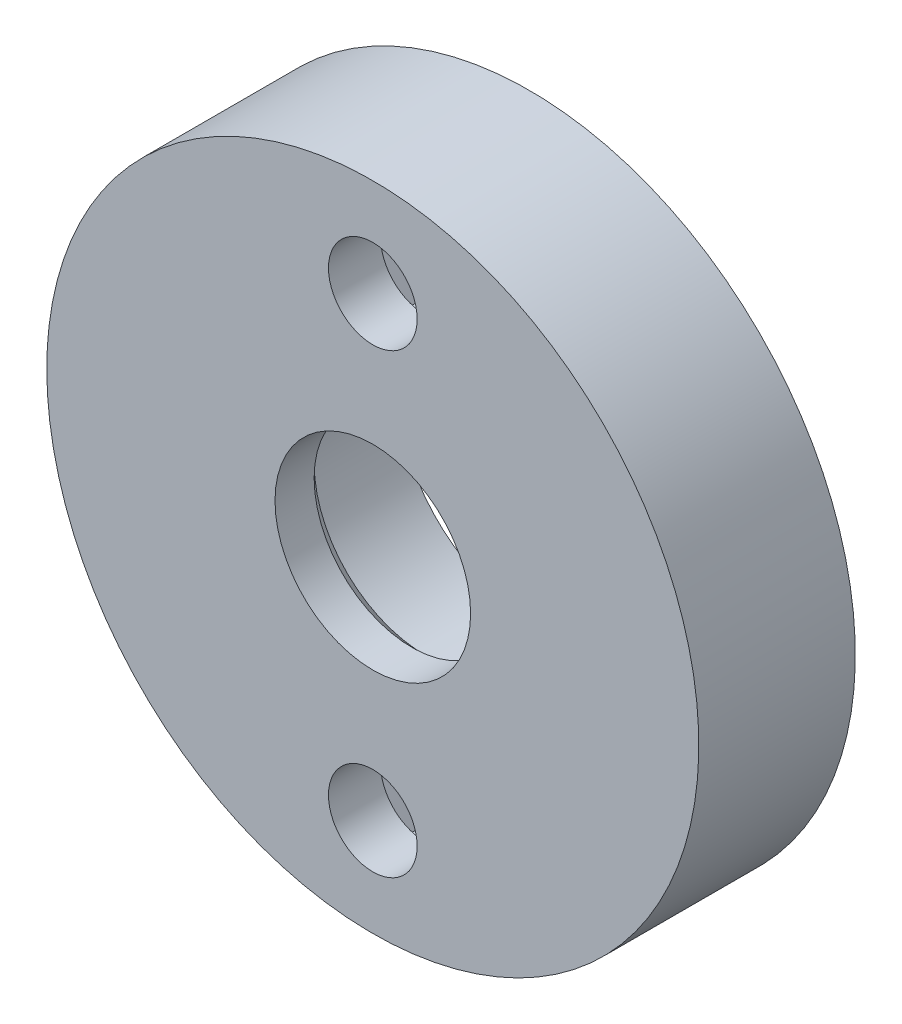
ISO-10303-21;
HEADER;
FILE_DESCRIPTION(('STEP AP214'),'2;1');
FILE_NAME('part.step','',(''),(''),'','','');
FILE_SCHEMA(('AUTOMOTIVE_DESIGN { 1 0 10303 214 1 1 1 1 }'));
ENDSEC;
DATA;
#1=APPLICATION_CONTEXT('core data for automotive mechanical design processes');
#2=APPLICATION_PROTOCOL_DEFINITION('international standard','automotive_design',2000,#1);
#3=PRODUCT_CONTEXT('',#1,'mechanical');
#4=PRODUCT('Part','Part','',(#3));
#5=PRODUCT_RELATED_PRODUCT_CATEGORY('part','',(#4));
#6=PRODUCT_DEFINITION_FORMATION('','',#4);
#7=PRODUCT_DEFINITION_CONTEXT('part definition',#1,'design');
#8=PRODUCT_DEFINITION('design','',#6,#7);
#9=PRODUCT_DEFINITION_SHAPE('','',#8);
#10=(LENGTH_UNIT() NAMED_UNIT(*) SI_UNIT(.MILLI.,.METRE.));
#11=(NAMED_UNIT(*) PLANE_ANGLE_UNIT() SI_UNIT($,.RADIAN.));
#12=(NAMED_UNIT(*) SI_UNIT($,.STERADIAN.) SOLID_ANGLE_UNIT());
#13=UNCERTAINTY_MEASURE_WITH_UNIT(LENGTH_MEASURE(1.E-05),#10,'distance_accuracy_value','');
#14=(GEOMETRIC_REPRESENTATION_CONTEXT(3) GLOBAL_UNCERTAINTY_ASSIGNED_CONTEXT((#13)) GLOBAL_UNIT_ASSIGNED_CONTEXT((#10,
#11,#12)) REPRESENTATION_CONTEXT('',''));
#15=CARTESIAN_POINT('',(0.,0.,0.));
#16=DIRECTION('',(0.,0.,1.));
#17=DIRECTION('',(1.,0.,0.));
#18=AXIS2_PLACEMENT_3D('',#15,#16,#17);
#19=CARTESIAN_POINT('',(0.,0.,6.));
#20=DIRECTION('',(0.,0.,1.));
#21=DIRECTION('',(-1.,0.,0.));
#22=AXIS2_PLACEMENT_3D('',#19,#20,#21);
#23=ELLIPSE('',#22,12.5,12.5);
#24=DIRECTION('',(0.,0.,-1.));
#25=VECTOR('',#24,1.);
#26=SURFACE_OF_LINEAR_EXTRUSION('',#23,#25);
#27=CARTESIAN_POINT('',(-12.5,0.,6.));
#28=VERTEX_POINT('',#27);
#29=EDGE_CURVE('E249',#28,#28,#23,.T.);
#30=ORIENTED_EDGE('',*,*,#29,.F.);
#31=EDGE_LOOP('',(#30));
#32=FACE_BOUND('',#31,.T.);
#33=CARTESIAN_POINT('',(0.,0.,0.));
#34=DIRECTION('',(0.,0.,1.));
#35=DIRECTION('',(-1.,0.,0.));
#36=AXIS2_PLACEMENT_3D('',#33,#34,#35);
#37=ELLIPSE('',#36,12.5,12.5);
#38=CARTESIAN_POINT('',(-12.5,0.,0.));
#39=VERTEX_POINT('',#38);
#40=EDGE_CURVE('E246',#39,#39,#37,.T.);
#41=ORIENTED_EDGE('',*,*,#40,.T.);
#42=EDGE_LOOP('',(#41));
#43=FACE_BOUND('',#42,.T.);
#44=ADVANCED_FACE('F45',(#32,#43),#26,.F.);
#45=CARTESIAN_POINT('',(0.,0.,6.));
#46=DIRECTION('',(0.,0.,1.));
#47=DIRECTION('',(1.,0.,0.));
#48=AXIS2_PLACEMENT_3D('',#45,#46,#47);
#49=PLANE('',#48);
#50=CARTESIAN_POINT('',(0.,8.74999999999999,6.));
#51=DIRECTION('',(0.,0.,1.));
#52=DIRECTION('',(1.,0.,0.));
#53=AXIS2_PLACEMENT_3D('',#50,#51,#52);
#54=CIRCLE('',#53,1.7);
#55=CARTESIAN_POINT('',(1.7,8.74999999999999,6.));
#56=VERTEX_POINT('',#55);
#57=EDGE_CURVE('E338',#56,#56,#54,.F.);
#58=ORIENTED_EDGE('',*,*,#57,.T.);
#59=EDGE_LOOP('',(#58));
#60=FACE_BOUND('',#59,.T.);
#61=CARTESIAN_POINT('',(0.,-8.74999999999999,6.));
#62=DIRECTION('',(0.,0.,1.));
#63=DIRECTION('',(1.,0.,0.));
#64=AXIS2_PLACEMENT_3D('',#61,#62,#63);
#65=CIRCLE('',#64,1.7);
#66=CARTESIAN_POINT('',(1.7,-8.74999999999999,6.));
#67=VERTEX_POINT('',#66);
#68=EDGE_CURVE('E342',#67,#67,#65,.F.);
#69=ORIENTED_EDGE('',*,*,#68,.T.);
#70=EDGE_LOOP('',(#69));
#71=FACE_BOUND('',#70,.T.);
#72=CARTESIAN_POINT('',(0.,0.,6.));
#73=DIRECTION('',(0.,0.,1.));
#74=DIRECTION('',(1.,0.,0.));
#75=AXIS2_PLACEMENT_3D('',#72,#73,#74);
#76=CIRCLE('',#75,3.75);
#77=CARTESIAN_POINT('',(3.75,0.,6.));
#78=VERTEX_POINT('',#77);
#79=EDGE_CURVE('E185',#78,#78,#76,.F.);
#80=ORIENTED_EDGE('',*,*,#79,.T.);
#81=EDGE_LOOP('',(#80));
#82=FACE_BOUND('',#81,.T.);
#83=ORIENTED_EDGE('',*,*,#29,.T.);
#84=EDGE_LOOP('',(#83));
#85=FACE_BOUND('',#84,.T.);
#86=ADVANCED_FACE('F255',(#60,#71,#82,#85),#49,.T.);
#87=CARTESIAN_POINT('',(0.,0.,0.));
#88=DIRECTION('',(0.,0.,1.));
#89=DIRECTION('',(1.,0.,0.));
#90=AXIS2_PLACEMENT_3D('',#87,#88,#89);
#91=PLANE('',#90);
#92=DIRECTION('',(0.5,0.866025403784439,0.));
#93=VECTOR('',#92,1.);
#94=CARTESIAN_POINT('',(-3.11769145362398,8.75,0.));
#95=LINE('',#94,#93);
#96=CARTESIAN_POINT('',(-3.11769145362398,8.75,0.));
#97=VERTEX_POINT('',#96);
#98=CARTESIAN_POINT('',(-1.55884572681199,11.45,0.));
#99=VERTEX_POINT('',#98);
#100=EDGE_CURVE('E173',#97,#99,#95,.T.);
#101=ORIENTED_EDGE('',*,*,#100,.F.);
#102=DIRECTION('',(-0.5,0.866025403784439,0.));
#103=VECTOR('',#102,1.);
#104=CARTESIAN_POINT('',(-1.55884572681199,6.04999999999999,0.));
#105=LINE('',#104,#103);
#106=CARTESIAN_POINT('',(-1.55884572681199,6.04999999999999,0.));
#107=VERTEX_POINT('',#106);
#108=EDGE_CURVE('E61',#107,#97,#105,.T.);
#109=ORIENTED_EDGE('',*,*,#108,.F.);
#110=DIRECTION('',(-1.,0.,0.));
#111=VECTOR('',#110,1.);
#112=CARTESIAN_POINT('',(1.55884572681199,6.04999999999999,0.));
#113=LINE('',#112,#111);
#114=CARTESIAN_POINT('',(1.55884572681199,6.04999999999999,0.));
#115=VERTEX_POINT('',#114);
#116=EDGE_CURVE('E156',#115,#107,#113,.T.);
#117=ORIENTED_EDGE('',*,*,#116,.F.);
#118=DIRECTION('',(-0.5,-0.866025403784439,0.));
#119=VECTOR('',#118,1.);
#120=CARTESIAN_POINT('',(3.11769145362398,8.74999999999999,0.));
#121=LINE('',#120,#119);
#122=CARTESIAN_POINT('',(3.11769145362398,8.74999999999999,0.));
#123=VERTEX_POINT('',#122);
#124=EDGE_CURVE('E159',#123,#115,#121,.T.);
#125=ORIENTED_EDGE('',*,*,#124,.F.);
#126=DIRECTION('',(0.5,-0.866025403784439,0.));
#127=VECTOR('',#126,1.);
#128=CARTESIAN_POINT('',(1.55884572681199,11.45,0.));
#129=LINE('',#128,#127);
#130=CARTESIAN_POINT('',(1.55884572681199,11.45,0.));
#131=VERTEX_POINT('',#130);
#132=EDGE_CURVE('E178',#131,#123,#129,.T.);
#133=ORIENTED_EDGE('',*,*,#132,.F.);
#134=DIRECTION('',(1.,0.,0.));
#135=VECTOR('',#134,1.);
#136=CARTESIAN_POINT('',(-1.55884572681199,11.45,0.));
#137=LINE('',#136,#135);
#138=EDGE_CURVE('E175',#99,#131,#137,.T.);
#139=ORIENTED_EDGE('',*,*,#138,.F.);
#140=EDGE_LOOP('',(#101,#109,#117,#125,#133,#139));
#141=FACE_BOUND('',#140,.T.);
#142=DIRECTION('',(-0.5,-0.866025403784439,0.));
#143=VECTOR('',#142,1.);
#144=CARTESIAN_POINT('',(3.11769145362398,-8.75,0.));
#145=LINE('',#144,#143);
#146=CARTESIAN_POINT('',(3.11769145362398,-8.75,0.));
#147=VERTEX_POINT('',#146);
#148=CARTESIAN_POINT('',(1.55884572681199,-11.45,0.));
#149=VERTEX_POINT('',#148);
#150=EDGE_CURVE('E220',#147,#149,#145,.T.);
#151=ORIENTED_EDGE('',*,*,#150,.F.);
#152=DIRECTION('',(0.5,-0.866025403784439,0.));
#153=VECTOR('',#152,1.);
#154=CARTESIAN_POINT('',(1.55884572681199,-6.05,0.));
#155=LINE('',#154,#153);
#156=CARTESIAN_POINT('',(1.55884572681199,-6.05,0.));
#157=VERTEX_POINT('',#156);
#158=EDGE_CURVE('E69',#157,#147,#155,.T.);
#159=ORIENTED_EDGE('',*,*,#158,.F.);
#160=DIRECTION('',(1.,0.,0.));
#161=VECTOR('',#160,1.);
#162=CARTESIAN_POINT('',(-1.55884572681199,-6.05,0.));
#163=LINE('',#162,#161);
#164=CARTESIAN_POINT('',(-1.55884572681199,-6.05,0.));
#165=VERTEX_POINT('',#164);
#166=EDGE_CURVE('E207',#165,#157,#163,.T.);
#167=ORIENTED_EDGE('',*,*,#166,.F.);
#168=DIRECTION('',(0.5,0.866025403784439,0.));
#169=VECTOR('',#168,1.);
#170=CARTESIAN_POINT('',(-3.11769145362398,-8.75,0.));
#171=LINE('',#170,#169);
#172=CARTESIAN_POINT('',(-3.11769145362398,-8.75,0.));
#173=VERTEX_POINT('',#172);
#174=EDGE_CURVE('E210',#173,#165,#171,.T.);
#175=ORIENTED_EDGE('',*,*,#174,.F.);
#176=DIRECTION('',(-0.5,0.866025403784439,0.));
#177=VECTOR('',#176,1.);
#178=CARTESIAN_POINT('',(-1.55884572681199,-11.45,0.));
#179=LINE('',#178,#177);
#180=CARTESIAN_POINT('',(-1.55884572681199,-11.45,0.));
#181=VERTEX_POINT('',#180);
#182=EDGE_CURVE('E214',#181,#173,#179,.T.);
#183=ORIENTED_EDGE('',*,*,#182,.F.);
#184=DIRECTION('',(-1.,0.,0.));
#185=VECTOR('',#184,1.);
#186=CARTESIAN_POINT('',(1.55884572681199,-11.45,0.));
#187=LINE('',#186,#185);
#188=EDGE_CURVE('E217',#149,#181,#187,.T.);
#189=ORIENTED_EDGE('',*,*,#188,.F.);
#190=EDGE_LOOP('',(#151,#159,#167,#175,#183,#189));
#191=FACE_BOUND('',#190,.T.);
#192=CARTESIAN_POINT('',(0.,0.,0.));
#193=DIRECTION('',(0.,0.,-1.));
#194=DIRECTION('',(-1.,0.,0.));
#195=AXIS2_PLACEMENT_3D('',#192,#193,#194);
#196=CIRCLE('',#195,5.);
#197=CARTESIAN_POINT('',(-5.,0.,0.));
#198=VERTEX_POINT('',#197);
#199=EDGE_CURVE('E242',#198,#198,#196,.T.);
#200=ORIENTED_EDGE('',*,*,#199,.F.);
#201=EDGE_LOOP('',(#200));
#202=FACE_BOUND('',#201,.T.);
#203=ORIENTED_EDGE('',*,*,#40,.F.);
#204=EDGE_LOOP('',(#203));
#205=FACE_BOUND('',#204,.T.);
#206=ADVANCED_FACE('F257',(#141,#191,#202,#205),#91,.F.);
#207=CARTESIAN_POINT('',(0.,0.,4.));
#208=DIRECTION('',(0.,0.,-1.));
#209=DIRECTION('',(-1.,0.,0.));
#210=AXIS2_PLACEMENT_3D('',#207,#208,#209);
#211=CYLINDRICAL_SURFACE('',#210,5.);
#212=CARTESIAN_POINT('',(0.,0.,4.));
#213=DIRECTION('',(0.,0.,-1.));
#214=DIRECTION('',(-1.,0.,0.));
#215=AXIS2_PLACEMENT_3D('',#212,#213,#214);
#216=CIRCLE('',#215,5.);
#217=CARTESIAN_POINT('',(-5.,0.,4.));
#218=VERTEX_POINT('',#217);
#219=EDGE_CURVE('E243',#218,#218,#216,.T.);
#220=ORIENTED_EDGE('',*,*,#219,.F.);
#221=EDGE_LOOP('',(#220));
#222=FACE_BOUND('',#221,.T.);
#223=ORIENTED_EDGE('',*,*,#199,.T.);
#224=EDGE_LOOP('',(#223));
#225=FACE_BOUND('',#224,.T.);
#226=ADVANCED_FACE('F260',(#222,#225),#211,.F.);
#227=CARTESIAN_POINT('',(0.,0.,4.));
#228=DIRECTION('',(0.,0.,-1.));
#229=DIRECTION('',(-1.,0.,0.));
#230=AXIS2_PLACEMENT_3D('',#227,#228,#229);
#231=PLANE('',#230);
#232=CARTESIAN_POINT('',(0.,0.,4.));
#233=DIRECTION('',(0.,0.,-1.));
#234=DIRECTION('',(-1.,0.,0.));
#235=AXIS2_PLACEMENT_3D('',#232,#233,#234);
#236=CIRCLE('',#235,4.25000000000001);
#237=CARTESIAN_POINT('',(-4.25000000000001,0.,4.));
#238=VERTEX_POINT('',#237);
#239=EDGE_CURVE('E11',#238,#238,#236,.F.);
#240=ORIENTED_EDGE('',*,*,#239,.T.);
#241=EDGE_LOOP('',(#240));
#242=FACE_BOUND('',#241,.T.);
#243=ORIENTED_EDGE('',*,*,#219,.T.);
#244=EDGE_LOOP('',(#243));
#245=FACE_BOUND('',#244,.T.);
#246=ADVANCED_FACE('F267',(#242,#245),#231,.T.);
#247=CARTESIAN_POINT('',(0.,0.,6.001));
#248=DIRECTION('',(0.,0.,-1.));
#249=DIRECTION('',(-1.,0.,0.));
#250=AXIS2_PLACEMENT_3D('',#247,#248,#249);
#251=CYLINDRICAL_SURFACE('',#250,3.75);
#252=CARTESIAN_POINT('',(0.,0.,4.50000000000001));
#253=DIRECTION('',(0.,0.,-1.));
#254=DIRECTION('',(-1.,0.,0.));
#255=AXIS2_PLACEMENT_3D('',#252,#253,#254);
#256=CIRCLE('',#255,3.75);
#257=CARTESIAN_POINT('',(-3.75,0.,4.50000000000001));
#258=VERTEX_POINT('',#257);
#259=EDGE_CURVE('E54',#258,#258,#256,.T.);
#260=ORIENTED_EDGE('',*,*,#259,.T.);
#261=EDGE_LOOP('',(#260));
#262=FACE_BOUND('',#261,.T.);
#263=ORIENTED_EDGE('',*,*,#79,.F.);
#264=EDGE_LOOP('',(#263));
#265=FACE_BOUND('',#264,.T.);
#266=ADVANCED_FACE('F271',(#262,#265),#251,.F.);
#267=CARTESIAN_POINT('',(0.,0.,4.50000000000001));
#268=DIRECTION('',(0.,0.,-1.));
#269=DIRECTION('',(-1.,0.,0.));
#270=AXIS2_PLACEMENT_3D('',#267,#268,#269);
#271=CONICAL_SURFACE('',#270,3.75,0.785398163397448);
#272=ORIENTED_EDGE('',*,*,#239,.F.);
#273=EDGE_LOOP('',(#272));
#274=FACE_BOUND('',#273,.T.);
#275=ORIENTED_EDGE('',*,*,#259,.F.);
#276=EDGE_LOOP('',(#275));
#277=FACE_BOUND('',#276,.T.);
#278=ADVANCED_FACE('F48',(#274,#277),#271,.F.);
#279=CARTESIAN_POINT('',(1.55884572681199,-6.05,4.));
#280=DIRECTION('',(0.866025403784439,0.5,0.));
#281=DIRECTION('',(-0.5,0.866025403784439,0.));
#282=AXIS2_PLACEMENT_3D('',#279,#280,#281);
#283=PLANE('',#282);
#284=ORIENTED_EDGE('',*,*,#158,.T.);
#285=DIRECTION('',(0.,0.,-1.));
#286=VECTOR('',#285,1.);
#287=CARTESIAN_POINT('',(3.11769145362398,-8.75,4.));
#288=LINE('',#287,#286);
#289=CARTESIAN_POINT('',(3.11769145362398,-8.75,4.));
#290=VERTEX_POINT('',#289);
#291=EDGE_CURVE('E193',#290,#147,#288,.T.);
#292=ORIENTED_EDGE('',*,*,#291,.F.);
#293=DIRECTION('',(0.5,-0.866025403784439,0.));
#294=VECTOR('',#293,1.);
#295=CARTESIAN_POINT('',(1.55884572681199,-6.05,4.));
#296=LINE('',#295,#294);
#297=CARTESIAN_POINT('',(1.55884572681199,-6.05,4.));
#298=VERTEX_POINT('',#297);
#299=EDGE_CURVE('E211',#298,#290,#296,.T.);
#300=ORIENTED_EDGE('',*,*,#299,.F.);
#301=DIRECTION('',(0.,0.,-1.));
#302=VECTOR('',#301,1.);
#303=CARTESIAN_POINT('',(1.55884572681199,-6.05,4.));
#304=LINE('',#303,#302);
#305=EDGE_CURVE('E204',#298,#157,#304,.T.);
#306=ORIENTED_EDGE('',*,*,#305,.T.);
#307=EDGE_LOOP('',(#284,#292,#300,#306));
#308=FACE_BOUND('',#307,.T.);
#309=ADVANCED_FACE('F285',(#308),#283,.F.);
#310=CARTESIAN_POINT('',(-1.55884572681199,-6.05,4.));
#311=DIRECTION('',(0.,1.,0.));
#312=DIRECTION('',(0.,0.,1.));
#313=AXIS2_PLACEMENT_3D('',#310,#311,#312);
#314=PLANE('',#313);
#315=ORIENTED_EDGE('',*,*,#166,.T.);
#316=ORIENTED_EDGE('',*,*,#305,.F.);
#317=DIRECTION('',(1.,0.,0.));
#318=VECTOR('',#317,1.);
#319=CARTESIAN_POINT('',(-1.55884572681199,-6.05,4.));
#320=LINE('',#319,#318);
#321=CARTESIAN_POINT('',(-1.55884572681199,-6.05,4.));
#322=VERTEX_POINT('',#321);
#323=EDGE_CURVE('E195',#322,#298,#320,.T.);
#324=ORIENTED_EDGE('',*,*,#323,.F.);
#325=DIRECTION('',(0.,0.,-1.));
#326=VECTOR('',#325,1.);
#327=CARTESIAN_POINT('',(-1.55884572681199,-6.05,4.));
#328=LINE('',#327,#326);
#329=EDGE_CURVE('E202',#322,#165,#328,.T.);
#330=ORIENTED_EDGE('',*,*,#329,.T.);
#331=EDGE_LOOP('',(#315,#316,#324,#330));
#332=FACE_BOUND('',#331,.T.);
#333=ADVANCED_FACE('F281',(#332),#314,.F.);
#334=CARTESIAN_POINT('',(-3.11769145362398,-8.75,4.));
#335=DIRECTION('',(-0.866025403784439,0.5,0.));
#336=DIRECTION('',(-0.5,-0.866025403784439,0.));
#337=AXIS2_PLACEMENT_3D('',#334,#335,#336);
#338=PLANE('',#337);
#339=ORIENTED_EDGE('',*,*,#174,.T.);
#340=ORIENTED_EDGE('',*,*,#329,.F.);
#341=DIRECTION('',(0.5,0.866025403784439,0.));
#342=VECTOR('',#341,1.);
#343=CARTESIAN_POINT('',(-3.11769145362398,-8.75,4.));
#344=LINE('',#343,#342);
#345=CARTESIAN_POINT('',(-3.11769145362398,-8.75,4.));
#346=VERTEX_POINT('',#345);
#347=EDGE_CURVE('E226',#346,#322,#344,.T.);
#348=ORIENTED_EDGE('',*,*,#347,.F.);
#349=DIRECTION('',(0.,0.,-1.));
#350=VECTOR('',#349,1.);
#351=CARTESIAN_POINT('',(-3.11769145362398,-8.75,4.));
#352=LINE('',#351,#350);
#353=EDGE_CURVE('E200',#346,#173,#352,.T.);
#354=ORIENTED_EDGE('',*,*,#353,.T.);
#355=EDGE_LOOP('',(#339,#340,#348,#354));
#356=FACE_BOUND('',#355,.T.);
#357=ADVANCED_FACE('F284',(#356),#338,.F.);
#358=CARTESIAN_POINT('',(-1.55884572681199,-11.45,4.));
#359=DIRECTION('',(-0.866025403784439,-0.5,0.));
#360=DIRECTION('',(0.5,-0.866025403784439,0.));
#361=AXIS2_PLACEMENT_3D('',#358,#359,#360);
#362=PLANE('',#361);
#363=ORIENTED_EDGE('',*,*,#182,.T.);
#364=ORIENTED_EDGE('',*,*,#353,.F.);
#365=DIRECTION('',(-0.5,0.866025403784439,0.));
#366=VECTOR('',#365,1.);
#367=CARTESIAN_POINT('',(-1.55884572681199,-11.45,4.));
#368=LINE('',#367,#366);
#369=CARTESIAN_POINT('',(-1.55884572681199,-11.45,4.));
#370=VERTEX_POINT('',#369);
#371=EDGE_CURVE('E229',#370,#346,#368,.T.);
#372=ORIENTED_EDGE('',*,*,#371,.F.);
#373=DIRECTION('',(0.,0.,-1.));
#374=VECTOR('',#373,1.);
#375=CARTESIAN_POINT('',(-1.55884572681199,-11.45,4.));
#376=LINE('',#375,#374);
#377=EDGE_CURVE('E198',#370,#181,#376,.T.);
#378=ORIENTED_EDGE('',*,*,#377,.T.);
#379=EDGE_LOOP('',(#363,#364,#372,#378));
#380=FACE_BOUND('',#379,.T.);
#381=ADVANCED_FACE('F289',(#380),#362,.F.);
#382=CARTESIAN_POINT('',(1.55884572681199,-11.45,4.));
#383=DIRECTION('',(0.,-1.,0.));
#384=DIRECTION('',(0.,0.,-1.));
#385=AXIS2_PLACEMENT_3D('',#382,#383,#384);
#386=PLANE('',#385);
#387=ORIENTED_EDGE('',*,*,#188,.T.);
#388=ORIENTED_EDGE('',*,*,#377,.F.);
#389=DIRECTION('',(-1.,0.,0.));
#390=VECTOR('',#389,1.);
#391=CARTESIAN_POINT('',(1.55884572681199,-11.45,4.));
#392=LINE('',#391,#390);
#393=CARTESIAN_POINT('',(1.55884572681199,-11.45,4.));
#394=VERTEX_POINT('',#393);
#395=EDGE_CURVE('E232',#394,#370,#392,.T.);
#396=ORIENTED_EDGE('',*,*,#395,.F.);
#397=DIRECTION('',(0.,0.,-1.));
#398=VECTOR('',#397,1.);
#399=CARTESIAN_POINT('',(1.55884572681199,-11.45,4.));
#400=LINE('',#399,#398);
#401=EDGE_CURVE('E196',#394,#149,#400,.T.);
#402=ORIENTED_EDGE('',*,*,#401,.T.);
#403=EDGE_LOOP('',(#387,#388,#396,#402));
#404=FACE_BOUND('',#403,.T.);
#405=ADVANCED_FACE('F293',(#404),#386,.F.);
#406=CARTESIAN_POINT('',(3.11769145362398,-8.75,4.));
#407=DIRECTION('',(0.866025403784439,-0.5,0.));
#408=DIRECTION('',(0.5,0.866025403784439,0.));
#409=AXIS2_PLACEMENT_3D('',#406,#407,#408);
#410=PLANE('',#409);
#411=ORIENTED_EDGE('',*,*,#150,.T.);
#412=ORIENTED_EDGE('',*,*,#401,.F.);
#413=DIRECTION('',(-0.5,-0.866025403784439,0.));
#414=VECTOR('',#413,1.);
#415=CARTESIAN_POINT('',(3.11769145362398,-8.75,4.));
#416=LINE('',#415,#414);
#417=EDGE_CURVE('E235',#290,#394,#416,.T.);
#418=ORIENTED_EDGE('',*,*,#417,.F.);
#419=ORIENTED_EDGE('',*,*,#291,.T.);
#420=EDGE_LOOP('',(#411,#412,#418,#419));
#421=FACE_BOUND('',#420,.T.);
#422=ADVANCED_FACE('F279',(#421),#410,.F.);
#423=CARTESIAN_POINT('',(0.,0.,4.));
#424=DIRECTION('',(0.,0.,-1.));
#425=DIRECTION('',(-1.,0.,0.));
#426=AXIS2_PLACEMENT_3D('',#423,#424,#425);
#427=PLANE('',#426);
#428=CARTESIAN_POINT('',(0.,-8.74999999999999,4.));
#429=DIRECTION('',(0.,0.,-1.));
#430=DIRECTION('',(-1.,0.,0.));
#431=AXIS2_PLACEMENT_3D('',#428,#429,#430);
#432=CIRCLE('',#431,1.7);
#433=CARTESIAN_POINT('',(-1.7,-8.74999999999999,4.));
#434=VERTEX_POINT('',#433);
#435=EDGE_CURVE('E162',#434,#434,#432,.T.);
#436=ORIENTED_EDGE('',*,*,#435,.F.);
#437=EDGE_LOOP('',(#436));
#438=FACE_BOUND('',#437,.T.);
#439=ORIENTED_EDGE('',*,*,#299,.T.);
#440=ORIENTED_EDGE('',*,*,#417,.T.);
#441=ORIENTED_EDGE('',*,*,#395,.T.);
#442=ORIENTED_EDGE('',*,*,#371,.T.);
#443=ORIENTED_EDGE('',*,*,#347,.T.);
#444=ORIENTED_EDGE('',*,*,#323,.T.);
#445=EDGE_LOOP('',(#439,#440,#441,#442,#443,#444));
#446=FACE_BOUND('',#445,.T.);
#447=ADVANCED_FACE('F276',(#438,#446),#427,.T.);
#448=CARTESIAN_POINT('',(-1.55884572681199,6.04999999999999,4.));
#449=DIRECTION('',(-0.866025403784439,-0.5,0.));
#450=DIRECTION('',(0.5,-0.866025403784439,0.));
#451=AXIS2_PLACEMENT_3D('',#448,#449,#450);
#452=PLANE('',#451);
#453=ORIENTED_EDGE('',*,*,#108,.T.);
#454=DIRECTION('',(0.,0.,-1.));
#455=VECTOR('',#454,1.);
#456=CARTESIAN_POINT('',(-3.11769145362398,8.75,4.));
#457=LINE('',#456,#455);
#458=CARTESIAN_POINT('',(-3.11769145362398,8.75,4.));
#459=VERTEX_POINT('',#458);
#460=EDGE_CURVE('E133',#459,#97,#457,.T.);
#461=ORIENTED_EDGE('',*,*,#460,.F.);
#462=DIRECTION('',(-0.5,0.866025403784439,0.));
#463=VECTOR('',#462,1.);
#464=CARTESIAN_POINT('',(-1.55884572681199,6.04999999999999,4.));
#465=LINE('',#464,#463);
#466=CARTESIAN_POINT('',(-1.55884572681199,6.04999999999999,4.));
#467=VERTEX_POINT('',#466);
#468=EDGE_CURVE('E137',#467,#459,#465,.T.);
#469=ORIENTED_EDGE('',*,*,#468,.F.);
#470=DIRECTION('',(0.,0.,-1.));
#471=VECTOR('',#470,1.);
#472=CARTESIAN_POINT('',(-1.55884572681199,6.04999999999999,4.));
#473=LINE('',#472,#471);
#474=EDGE_CURVE('E183',#467,#107,#473,.T.);
#475=ORIENTED_EDGE('',*,*,#474,.T.);
#476=EDGE_LOOP('',(#453,#461,#469,#475));
#477=FACE_BOUND('',#476,.T.);
#478=ADVANCED_FACE('F135',(#477),#452,.F.);
#479=CARTESIAN_POINT('',(1.55884572681199,6.04999999999999,4.));
#480=DIRECTION('',(0.,-1.,0.));
#481=DIRECTION('',(0.,0.,-1.));
#482=AXIS2_PLACEMENT_3D('',#479,#480,#481);
#483=PLANE('',#482);
#484=ORIENTED_EDGE('',*,*,#116,.T.);
#485=ORIENTED_EDGE('',*,*,#474,.F.);
#486=DIRECTION('',(-1.,0.,0.));
#487=VECTOR('',#486,1.);
#488=CARTESIAN_POINT('',(1.55884572681199,6.04999999999999,4.));
#489=LINE('',#488,#487);
#490=CARTESIAN_POINT('',(1.55884572681199,6.04999999999999,4.));
#491=VERTEX_POINT('',#490);
#492=EDGE_CURVE('E143',#491,#467,#489,.T.);
#493=ORIENTED_EDGE('',*,*,#492,.F.);
#494=DIRECTION('',(0.,0.,-1.));
#495=VECTOR('',#494,1.);
#496=CARTESIAN_POINT('',(1.55884572681199,6.04999999999999,4.));
#497=LINE('',#496,#495);
#498=EDGE_CURVE('E186',#491,#115,#497,.T.);
#499=ORIENTED_EDGE('',*,*,#498,.T.);
#500=EDGE_LOOP('',(#484,#485,#493,#499));
#501=FACE_BOUND('',#500,.T.);
#502=ADVANCED_FACE('F305',(#501),#483,.F.);
#503=CARTESIAN_POINT('',(3.11769145362398,8.74999999999999,4.));
#504=DIRECTION('',(0.866025403784439,-0.5,0.));
#505=DIRECTION('',(0.5,0.866025403784439,0.));
#506=AXIS2_PLACEMENT_3D('',#503,#504,#505);
#507=PLANE('',#506);
#508=ORIENTED_EDGE('',*,*,#124,.T.);
#509=ORIENTED_EDGE('',*,*,#498,.F.);
#510=DIRECTION('',(-0.5,-0.866025403784439,0.));
#511=VECTOR('',#510,1.);
#512=CARTESIAN_POINT('',(3.11769145362398,8.74999999999999,4.));
#513=LINE('',#512,#511);
#514=CARTESIAN_POINT('',(3.11769145362398,8.74999999999999,4.));
#515=VERTEX_POINT('',#514);
#516=EDGE_CURVE('E169',#515,#491,#513,.T.);
#517=ORIENTED_EDGE('',*,*,#516,.F.);
#518=DIRECTION('',(0.,0.,-1.));
#519=VECTOR('',#518,1.);
#520=CARTESIAN_POINT('',(3.11769145362398,8.74999999999999,4.));
#521=LINE('',#520,#519);
#522=EDGE_CURVE('E188',#515,#123,#521,.T.);
#523=ORIENTED_EDGE('',*,*,#522,.T.);
#524=EDGE_LOOP('',(#508,#509,#517,#523));
#525=FACE_BOUND('',#524,.T.);
#526=ADVANCED_FACE('F315',(#525),#507,.F.);
#527=CARTESIAN_POINT('',(1.55884572681199,11.45,4.));
#528=DIRECTION('',(0.866025403784439,0.5,0.));
#529=DIRECTION('',(-0.5,0.866025403784439,0.));
#530=AXIS2_PLACEMENT_3D('',#527,#528,#529);
#531=PLANE('',#530);
#532=ORIENTED_EDGE('',*,*,#132,.T.);
#533=ORIENTED_EDGE('',*,*,#522,.F.);
#534=DIRECTION('',(0.5,-0.866025403784439,0.));
#535=VECTOR('',#534,1.);
#536=CARTESIAN_POINT('',(1.55884572681199,11.45,4.));
#537=LINE('',#536,#535);
#538=CARTESIAN_POINT('',(1.55884572681199,11.45,4.));
#539=VERTEX_POINT('',#538);
#540=EDGE_CURVE('E166',#539,#515,#537,.T.);
#541=ORIENTED_EDGE('',*,*,#540,.F.);
#542=DIRECTION('',(0.,0.,-1.));
#543=VECTOR('',#542,1.);
#544=CARTESIAN_POINT('',(1.55884572681199,11.45,4.));
#545=LINE('',#544,#543);
#546=EDGE_CURVE('E190',#539,#131,#545,.T.);
#547=ORIENTED_EDGE('',*,*,#546,.T.);
#548=EDGE_LOOP('',(#532,#533,#541,#547));
#549=FACE_BOUND('',#548,.T.);
#550=ADVANCED_FACE('F311',(#549),#531,.F.);
#551=CARTESIAN_POINT('',(-1.55884572681199,11.45,4.));
#552=DIRECTION('',(0.,1.,0.));
#553=DIRECTION('',(0.,0.,1.));
#554=AXIS2_PLACEMENT_3D('',#551,#552,#553);
#555=PLANE('',#554);
#556=ORIENTED_EDGE('',*,*,#138,.T.);
#557=ORIENTED_EDGE('',*,*,#546,.F.);
#558=DIRECTION('',(1.,0.,0.));
#559=VECTOR('',#558,1.);
#560=CARTESIAN_POINT('',(-1.55884572681199,11.45,4.));
#561=LINE('',#560,#559);
#562=CARTESIAN_POINT('',(-1.55884572681199,11.45,4.));
#563=VERTEX_POINT('',#562);
#564=EDGE_CURVE('E151',#563,#539,#561,.T.);
#565=ORIENTED_EDGE('',*,*,#564,.F.);
#566=DIRECTION('',(0.,0.,-1.));
#567=VECTOR('',#566,1.);
#568=CARTESIAN_POINT('',(-1.55884572681199,11.45,4.));
#569=LINE('',#568,#567);
#570=EDGE_CURVE('E142',#563,#99,#569,.T.);
#571=ORIENTED_EDGE('',*,*,#570,.T.);
#572=EDGE_LOOP('',(#556,#557,#565,#571));
#573=FACE_BOUND('',#572,.T.);
#574=ADVANCED_FACE('F308',(#573),#555,.F.);
#575=CARTESIAN_POINT('',(-3.11769145362398,8.75,4.));
#576=DIRECTION('',(-0.866025403784439,0.5,0.));
#577=DIRECTION('',(-0.5,-0.866025403784439,0.));
#578=AXIS2_PLACEMENT_3D('',#575,#576,#577);
#579=PLANE('',#578);
#580=ORIENTED_EDGE('',*,*,#100,.T.);
#581=ORIENTED_EDGE('',*,*,#570,.F.);
#582=DIRECTION('',(0.5,0.866025403784439,0.));
#583=VECTOR('',#582,1.);
#584=CARTESIAN_POINT('',(-3.11769145362398,8.75,4.));
#585=LINE('',#584,#583);
#586=EDGE_CURVE('E146',#459,#563,#585,.T.);
#587=ORIENTED_EDGE('',*,*,#586,.F.);
#588=ORIENTED_EDGE('',*,*,#460,.T.);
#589=EDGE_LOOP('',(#580,#581,#587,#588));
#590=FACE_BOUND('',#589,.T.);
#591=ADVANCED_FACE('F147',(#590),#579,.F.);
#592=CARTESIAN_POINT('',(0.,0.,4.));
#593=DIRECTION('',(0.,0.,-1.));
#594=DIRECTION('',(-1.,0.,0.));
#595=AXIS2_PLACEMENT_3D('',#592,#593,#594);
#596=PLANE('',#595);
#597=CARTESIAN_POINT('',(0.,8.74999999999999,4.));
#598=DIRECTION('',(0.,0.,-1.));
#599=DIRECTION('',(-1.,0.,0.));
#600=AXIS2_PLACEMENT_3D('',#597,#598,#599);
#601=CIRCLE('',#600,1.7);
#602=CARTESIAN_POINT('',(-1.7,8.74999999999999,4.));
#603=VERTEX_POINT('',#602);
#604=EDGE_CURVE('E206',#603,#603,#601,.T.);
#605=ORIENTED_EDGE('',*,*,#604,.F.);
#606=EDGE_LOOP('',(#605));
#607=FACE_BOUND('',#606,.T.);
#608=ORIENTED_EDGE('',*,*,#468,.T.);
#609=ORIENTED_EDGE('',*,*,#586,.T.);
#610=ORIENTED_EDGE('',*,*,#564,.T.);
#611=ORIENTED_EDGE('',*,*,#540,.T.);
#612=ORIENTED_EDGE('',*,*,#516,.T.);
#613=ORIENTED_EDGE('',*,*,#492,.T.);
#614=EDGE_LOOP('',(#608,#609,#610,#611,#612,#613));
#615=FACE_BOUND('',#614,.T.);
#616=ADVANCED_FACE('F153',(#607,#615),#596,.T.);
#617=CARTESIAN_POINT('',(0.,-8.74999999999999,6.001));
#618=DIRECTION('',(0.,0.,-1.));
#619=DIRECTION('',(-1.,0.,0.));
#620=AXIS2_PLACEMENT_3D('',#617,#618,#619);
#621=CYLINDRICAL_SURFACE('',#620,1.7);
#622=ORIENTED_EDGE('',*,*,#68,.F.);
#623=EDGE_LOOP('',(#622));
#624=FACE_BOUND('',#623,.T.);
#625=ORIENTED_EDGE('',*,*,#435,.T.);
#626=EDGE_LOOP('',(#625));
#627=FACE_BOUND('',#626,.T.);
#628=ADVANCED_FACE('F325',(#624,#627),#621,.F.);
#629=CARTESIAN_POINT('',(0.,8.74999999999999,6.001));
#630=DIRECTION('',(0.,0.,-1.));
#631=DIRECTION('',(-1.,0.,0.));
#632=AXIS2_PLACEMENT_3D('',#629,#630,#631);
#633=CYLINDRICAL_SURFACE('',#632,1.7);
#634=ORIENTED_EDGE('',*,*,#57,.F.);
#635=EDGE_LOOP('',(#634));
#636=FACE_BOUND('',#635,.T.);
#637=ORIENTED_EDGE('',*,*,#604,.T.);
#638=EDGE_LOOP('',(#637));
#639=FACE_BOUND('',#638,.T.);
#640=ADVANCED_FACE('F329',(#636,#639),#633,.F.);
#641=CLOSED_SHELL('',(#44,#86,#206,#226,#246,#266,#278,#309,#333,#357,#381,#405,#422,#447,#478,
#502,#526,#550,#574,#591,#616,#628,#640));
#642=MANIFOLD_SOLID_BREP('B2',#641);
#643=ADVANCED_BREP_SHAPE_REPRESENTATION('',(#18,#642),#14);
#644=SHAPE_DEFINITION_REPRESENTATION(#9,#643);
ENDSEC;
END-ISO-10303-21;
